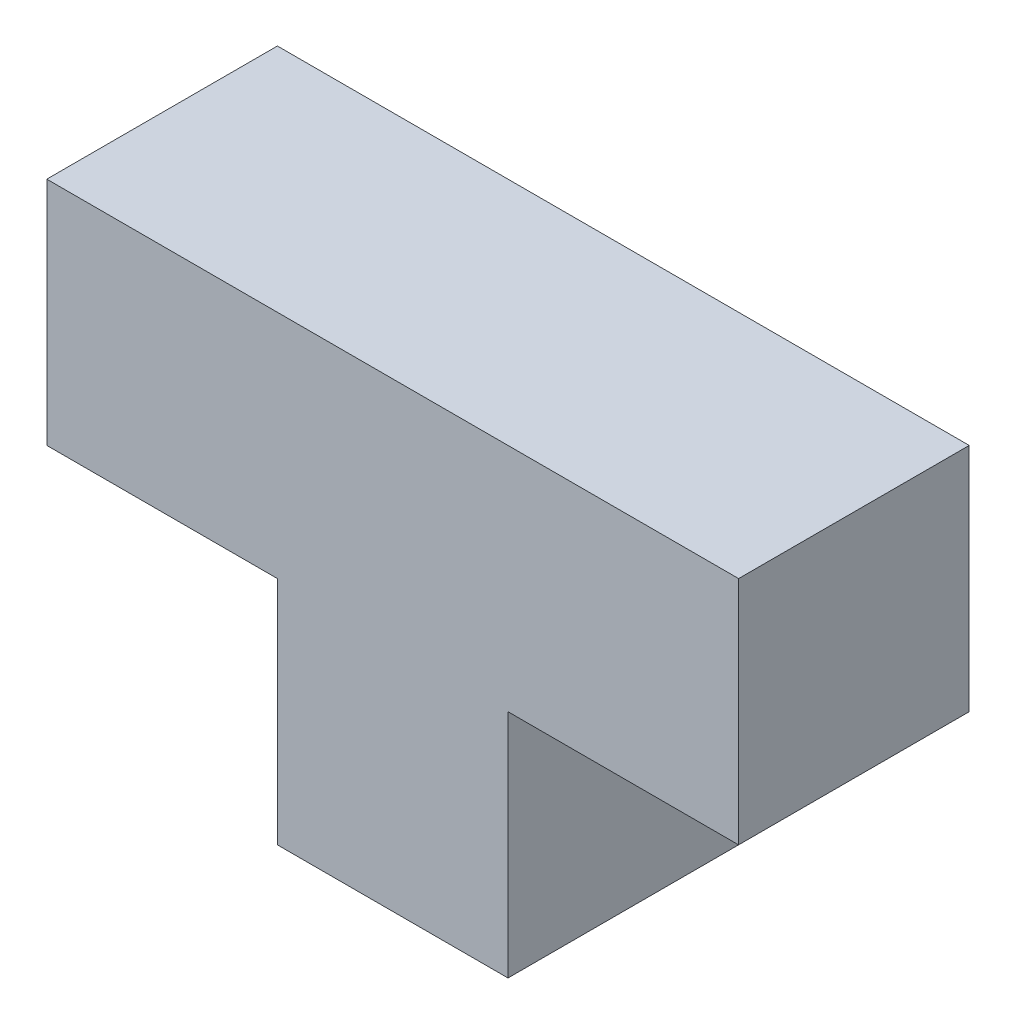
ISO-10303-21;
HEADER;
FILE_DESCRIPTION(('STEP AP214'),'2;1');
FILE_NAME('part.step','',(''),(''),'','','');
FILE_SCHEMA(('AUTOMOTIVE_DESIGN { 1 0 10303 214 1 1 1 1 }'));
ENDSEC;
DATA;
#1=APPLICATION_CONTEXT('core data for automotive mechanical design processes');
#2=APPLICATION_PROTOCOL_DEFINITION('international standard','automotive_design',2000,#1);
#3=PRODUCT_CONTEXT('',#1,'mechanical');
#4=PRODUCT('Part','Part','',(#3));
#5=PRODUCT_RELATED_PRODUCT_CATEGORY('part','',(#4));
#6=PRODUCT_DEFINITION_FORMATION('','',#4);
#7=PRODUCT_DEFINITION_CONTEXT('part definition',#1,'design');
#8=PRODUCT_DEFINITION('design','',#6,#7);
#9=PRODUCT_DEFINITION_SHAPE('','',#8);
#10=(LENGTH_UNIT() NAMED_UNIT(*) SI_UNIT(.MILLI.,.METRE.));
#11=(NAMED_UNIT(*) PLANE_ANGLE_UNIT() SI_UNIT($,.RADIAN.));
#12=(NAMED_UNIT(*) SI_UNIT($,.STERADIAN.) SOLID_ANGLE_UNIT());
#13=UNCERTAINTY_MEASURE_WITH_UNIT(LENGTH_MEASURE(1.E-05),#10,'distance_accuracy_value','');
#14=(GEOMETRIC_REPRESENTATION_CONTEXT(3) GLOBAL_UNCERTAINTY_ASSIGNED_CONTEXT((#13)) GLOBAL_UNIT_ASSIGNED_CONTEXT((#10,
#11,#12)) REPRESENTATION_CONTEXT('',''));
#15=CARTESIAN_POINT('',(0.,0.,0.));
#16=DIRECTION('',(0.,0.,1.));
#17=DIRECTION('',(1.,0.,0.));
#18=AXIS2_PLACEMENT_3D('',#15,#16,#17);
#19=CARTESIAN_POINT('',(19.05,19.05,19.05));
#20=DIRECTION('',(1.,0.,0.));
#21=DIRECTION('',(0.,1.,0.));
#22=AXIS2_PLACEMENT_3D('',#19,#20,#21);
#23=PLANE('',#22);
#24=DIRECTION('',(0.,-1.,0.));
#25=VECTOR('',#24,1.);
#26=CARTESIAN_POINT('',(19.05,19.05,0.));
#27=LINE('',#26,#25);
#28=CARTESIAN_POINT('',(19.05,19.05,0.));
#29=VERTEX_POINT('',#28);
#30=CARTESIAN_POINT('',(19.05,0.,0.));
#31=VERTEX_POINT('',#30);
#32=EDGE_CURVE('E138',#29,#31,#27,.T.);
#33=ORIENTED_EDGE('',*,*,#32,.F.);
#34=DIRECTION('',(0.,0.,-1.));
#35=VECTOR('',#34,1.);
#36=CARTESIAN_POINT('',(19.05,19.05,19.05));
#37=LINE('',#36,#35);
#38=CARTESIAN_POINT('',(19.05,19.05,19.05));
#39=VERTEX_POINT('',#38);
#40=EDGE_CURVE('E11',#39,#29,#37,.T.);
#41=ORIENTED_EDGE('',*,*,#40,.F.);
#42=DIRECTION('',(0.,-1.,0.));
#43=VECTOR('',#42,1.);
#44=CARTESIAN_POINT('',(19.05,19.05,19.05));
#45=LINE('',#44,#43);
#46=CARTESIAN_POINT('',(19.05,0.,19.05));
#47=VERTEX_POINT('',#46);
#48=EDGE_CURVE('E156',#39,#47,#45,.T.);
#49=ORIENTED_EDGE('',*,*,#48,.T.);
#50=DIRECTION('',(0.,0.,-1.));
#51=VECTOR('',#50,1.);
#52=CARTESIAN_POINT('',(19.05,0.,19.05));
#53=LINE('',#52,#51);
#54=EDGE_CURVE('E42',#47,#31,#53,.T.);
#55=ORIENTED_EDGE('',*,*,#54,.T.);
#56=EDGE_LOOP('',(#33,#41,#49,#55));
#57=FACE_BOUND('',#56,.T.);
#58=ADVANCED_FACE('F41',(#57),#23,.T.);
#59=CARTESIAN_POINT('',(38.1,19.05,19.05));
#60=DIRECTION('',(0.,-1.,0.));
#61=DIRECTION('',(1.,0.,0.));
#62=AXIS2_PLACEMENT_3D('',#59,#60,#61);
#63=PLANE('',#62);
#64=DIRECTION('',(-1.,0.,0.));
#65=VECTOR('',#64,1.);
#66=CARTESIAN_POINT('',(38.1,19.05,0.));
#67=LINE('',#66,#65);
#68=CARTESIAN_POINT('',(38.1,19.05,0.));
#69=VERTEX_POINT('',#68);
#70=EDGE_CURVE('E157',#69,#29,#67,.T.);
#71=ORIENTED_EDGE('',*,*,#70,.F.);
#72=DIRECTION('',(0.,0.,-1.));
#73=VECTOR('',#72,1.);
#74=CARTESIAN_POINT('',(38.1,19.05,19.05));
#75=LINE('',#74,#73);
#76=CARTESIAN_POINT('',(38.1,19.05,19.05));
#77=VERTEX_POINT('',#76);
#78=EDGE_CURVE('E49',#77,#69,#75,.T.);
#79=ORIENTED_EDGE('',*,*,#78,.F.);
#80=DIRECTION('',(-1.,0.,0.));
#81=VECTOR('',#80,1.);
#82=CARTESIAN_POINT('',(38.1,19.05,19.05));
#83=LINE('',#82,#81);
#84=EDGE_CURVE('E126',#77,#39,#83,.T.);
#85=ORIENTED_EDGE('',*,*,#84,.T.);
#86=ORIENTED_EDGE('',*,*,#40,.T.);
#87=EDGE_LOOP('',(#71,#79,#85,#86));
#88=FACE_BOUND('',#87,.T.);
#89=ADVANCED_FACE('F169',(#88),#63,.T.);
#90=CARTESIAN_POINT('',(38.1,38.1,19.05));
#91=DIRECTION('',(1.,0.,0.));
#92=DIRECTION('',(0.,1.,0.));
#93=AXIS2_PLACEMENT_3D('',#90,#91,#92);
#94=PLANE('',#93);
#95=DIRECTION('',(0.,-1.,0.));
#96=VECTOR('',#95,1.);
#97=CARTESIAN_POINT('',(38.1,38.1,0.));
#98=LINE('',#97,#96);
#99=CARTESIAN_POINT('',(38.1,38.1,0.));
#100=VERTEX_POINT('',#99);
#101=EDGE_CURVE('E113',#100,#69,#98,.T.);
#102=ORIENTED_EDGE('',*,*,#101,.F.);
#103=DIRECTION('',(0.,0.,-1.));
#104=VECTOR('',#103,1.);
#105=CARTESIAN_POINT('',(38.1,38.1,19.05));
#106=LINE('',#105,#104);
#107=CARTESIAN_POINT('',(38.1,38.1,19.05));
#108=VERTEX_POINT('',#107);
#109=EDGE_CURVE('E110',#108,#100,#106,.T.);
#110=ORIENTED_EDGE('',*,*,#109,.F.);
#111=DIRECTION('',(0.,-1.,0.));
#112=VECTOR('',#111,1.);
#113=CARTESIAN_POINT('',(38.1,38.1,19.05));
#114=LINE('',#113,#112);
#115=EDGE_CURVE('E111',#108,#77,#114,.T.);
#116=ORIENTED_EDGE('',*,*,#115,.T.);
#117=ORIENTED_EDGE('',*,*,#78,.T.);
#118=EDGE_LOOP('',(#102,#110,#116,#117));
#119=FACE_BOUND('',#118,.T.);
#120=ADVANCED_FACE('F115',(#119),#94,.T.);
#121=CARTESIAN_POINT('',(-19.05,38.1,19.05));
#122=DIRECTION('',(0.,1.,0.));
#123=DIRECTION('',(-1.,0.,0.));
#124=AXIS2_PLACEMENT_3D('',#121,#122,#123);
#125=PLANE('',#124);
#126=DIRECTION('',(1.,0.,0.));
#127=VECTOR('',#126,1.);
#128=CARTESIAN_POINT('',(-19.05,38.1,0.));
#129=LINE('',#128,#127);
#130=CARTESIAN_POINT('',(-19.05,38.1,0.));
#131=VERTEX_POINT('',#130);
#132=EDGE_CURVE('E154',#131,#100,#129,.T.);
#133=ORIENTED_EDGE('',*,*,#132,.F.);
#134=DIRECTION('',(0.,0.,-1.));
#135=VECTOR('',#134,1.);
#136=CARTESIAN_POINT('',(-19.05,38.1,19.05));
#137=LINE('',#136,#135);
#138=CARTESIAN_POINT('',(-19.05,38.1,19.05));
#139=VERTEX_POINT('',#138);
#140=EDGE_CURVE('E120',#139,#131,#137,.T.);
#141=ORIENTED_EDGE('',*,*,#140,.F.);
#142=DIRECTION('',(1.,0.,0.));
#143=VECTOR('',#142,1.);
#144=CARTESIAN_POINT('',(-19.05,38.1,19.05));
#145=LINE('',#144,#143);
#146=EDGE_CURVE('E128',#139,#108,#145,.T.);
#147=ORIENTED_EDGE('',*,*,#146,.T.);
#148=ORIENTED_EDGE('',*,*,#109,.T.);
#149=EDGE_LOOP('',(#133,#141,#147,#148));
#150=FACE_BOUND('',#149,.T.);
#151=ADVANCED_FACE('F127',(#150),#125,.T.);
#152=CARTESIAN_POINT('',(-19.05,19.05,19.05));
#153=DIRECTION('',(-1.,0.,0.));
#154=DIRECTION('',(0.,-1.,0.));
#155=AXIS2_PLACEMENT_3D('',#152,#153,#154);
#156=PLANE('',#155);
#157=DIRECTION('',(0.,1.,0.));
#158=VECTOR('',#157,1.);
#159=CARTESIAN_POINT('',(-19.05,19.05,0.));
#160=LINE('',#159,#158);
#161=CARTESIAN_POINT('',(-19.05,19.05,0.));
#162=VERTEX_POINT('',#161);
#163=EDGE_CURVE('E148',#162,#131,#160,.T.);
#164=ORIENTED_EDGE('',*,*,#163,.F.);
#165=DIRECTION('',(0.,0.,-1.));
#166=VECTOR('',#165,1.);
#167=CARTESIAN_POINT('',(-19.05,19.05,19.05));
#168=LINE('',#167,#166);
#169=CARTESIAN_POINT('',(-19.05,19.05,19.05));
#170=VERTEX_POINT('',#169);
#171=EDGE_CURVE('E162',#170,#162,#168,.T.);
#172=ORIENTED_EDGE('',*,*,#171,.F.);
#173=DIRECTION('',(0.,1.,0.));
#174=VECTOR('',#173,1.);
#175=CARTESIAN_POINT('',(-19.05,19.05,19.05));
#176=LINE('',#175,#174);
#177=EDGE_CURVE('E131',#170,#139,#176,.T.);
#178=ORIENTED_EDGE('',*,*,#177,.T.);
#179=ORIENTED_EDGE('',*,*,#140,.T.);
#180=EDGE_LOOP('',(#164,#172,#178,#179));
#181=FACE_BOUND('',#180,.T.);
#182=ADVANCED_FACE('F183',(#181),#156,.T.);
#183=CARTESIAN_POINT('',(0.,19.05,19.05));
#184=DIRECTION('',(0.,-1.,0.));
#185=DIRECTION('',(0.,0.,-1.));
#186=AXIS2_PLACEMENT_3D('',#183,#184,#185);
#187=PLANE('',#186);
#188=DIRECTION('',(-1.,0.,0.));
#189=VECTOR('',#188,1.);
#190=CARTESIAN_POINT('',(0.,19.05,0.));
#191=LINE('',#190,#189);
#192=CARTESIAN_POINT('',(0.,19.05,0.));
#193=VERTEX_POINT('',#192);
#194=EDGE_CURVE('E150',#193,#162,#191,.T.);
#195=ORIENTED_EDGE('',*,*,#194,.F.);
#196=DIRECTION('',(0.,0.,-1.));
#197=VECTOR('',#196,1.);
#198=CARTESIAN_POINT('',(0.,19.05,19.05));
#199=LINE('',#198,#197);
#200=CARTESIAN_POINT('',(0.,19.05,19.05));
#201=VERTEX_POINT('',#200);
#202=EDGE_CURVE('E163',#201,#193,#199,.T.);
#203=ORIENTED_EDGE('',*,*,#202,.F.);
#204=DIRECTION('',(-1.,0.,0.));
#205=VECTOR('',#204,1.);
#206=CARTESIAN_POINT('',(0.,19.05,19.05));
#207=LINE('',#206,#205);
#208=EDGE_CURVE('E133',#201,#170,#207,.T.);
#209=ORIENTED_EDGE('',*,*,#208,.T.);
#210=ORIENTED_EDGE('',*,*,#171,.T.);
#211=EDGE_LOOP('',(#195,#203,#209,#210));
#212=FACE_BOUND('',#211,.T.);
#213=ADVANCED_FACE('F186',(#212),#187,.T.);
#214=CARTESIAN_POINT('',(0.,0.,19.05));
#215=DIRECTION('',(-1.,0.,0.));
#216=DIRECTION('',(0.,-1.,0.));
#217=AXIS2_PLACEMENT_3D('',#214,#215,#216);
#218=PLANE('',#217);
#219=DIRECTION('',(0.,1.,0.));
#220=VECTOR('',#219,1.);
#221=CARTESIAN_POINT('',(0.,0.,0.));
#222=LINE('',#221,#220);
#223=CARTESIAN_POINT('',(0.,0.,0.));
#224=VERTEX_POINT('',#223);
#225=EDGE_CURVE('E143',#224,#193,#222,.T.);
#226=ORIENTED_EDGE('',*,*,#225,.F.);
#227=DIRECTION('',(0.,0.,-1.));
#228=VECTOR('',#227,1.);
#229=CARTESIAN_POINT('',(0.,0.,19.05));
#230=LINE('',#229,#228);
#231=CARTESIAN_POINT('',(0.,0.,19.05));
#232=VERTEX_POINT('',#231);
#233=EDGE_CURVE('E165',#232,#224,#230,.T.);
#234=ORIENTED_EDGE('',*,*,#233,.F.);
#235=DIRECTION('',(0.,1.,0.));
#236=VECTOR('',#235,1.);
#237=CARTESIAN_POINT('',(0.,0.,19.05));
#238=LINE('',#237,#236);
#239=EDGE_CURVE('E263',#232,#201,#238,.T.);
#240=ORIENTED_EDGE('',*,*,#239,.T.);
#241=ORIENTED_EDGE('',*,*,#202,.T.);
#242=EDGE_LOOP('',(#226,#234,#240,#241));
#243=FACE_BOUND('',#242,.T.);
#244=ADVANCED_FACE('F189',(#243),#218,.T.);
#245=CARTESIAN_POINT('',(19.05,0.,19.05));
#246=DIRECTION('',(0.,-1.,0.));
#247=DIRECTION('',(1.,0.,0.));
#248=AXIS2_PLACEMENT_3D('',#245,#246,#247);
#249=PLANE('',#248);
#250=DIRECTION('',(-1.,0.,0.));
#251=VECTOR('',#250,1.);
#252=CARTESIAN_POINT('',(19.05,0.,0.));
#253=LINE('',#252,#251);
#254=EDGE_CURVE('E141',#31,#224,#253,.T.);
#255=ORIENTED_EDGE('',*,*,#254,.F.);
#256=ORIENTED_EDGE('',*,*,#54,.F.);
#257=DIRECTION('',(-1.,0.,0.));
#258=VECTOR('',#257,1.);
#259=CARTESIAN_POINT('',(19.05,0.,19.05));
#260=LINE('',#259,#258);
#261=EDGE_CURVE('E265',#47,#232,#260,.T.);
#262=ORIENTED_EDGE('',*,*,#261,.T.);
#263=ORIENTED_EDGE('',*,*,#233,.T.);
#264=EDGE_LOOP('',(#255,#256,#262,#263));
#265=FACE_BOUND('',#264,.T.);
#266=ADVANCED_FACE('F167',(#265),#249,.T.);
#267=CARTESIAN_POINT('',(0.,0.,19.05));
#268=DIRECTION('',(0.,0.,-1.));
#269=DIRECTION('',(-1.,0.,0.));
#270=AXIS2_PLACEMENT_3D('',#267,#268,#269);
#271=PLANE('',#270);
#272=ORIENTED_EDGE('',*,*,#48,.F.);
#273=ORIENTED_EDGE('',*,*,#84,.F.);
#274=ORIENTED_EDGE('',*,*,#115,.F.);
#275=ORIENTED_EDGE('',*,*,#146,.F.);
#276=ORIENTED_EDGE('',*,*,#177,.F.);
#277=ORIENTED_EDGE('',*,*,#208,.F.);
#278=ORIENTED_EDGE('',*,*,#239,.F.);
#279=ORIENTED_EDGE('',*,*,#261,.F.);
#280=EDGE_LOOP('',(#272,#273,#274,#275,#276,#277,#278,#279));
#281=FACE_BOUND('',#280,.T.);
#282=ADVANCED_FACE('F125',(#281),#271,.F.);
#283=CARTESIAN_POINT('',(0.,0.,0.));
#284=DIRECTION('',(0.,0.,-1.));
#285=DIRECTION('',(-1.,0.,0.));
#286=AXIS2_PLACEMENT_3D('',#283,#284,#285);
#287=PLANE('',#286);
#288=ORIENTED_EDGE('',*,*,#32,.T.);
#289=ORIENTED_EDGE('',*,*,#254,.T.);
#290=ORIENTED_EDGE('',*,*,#225,.T.);
#291=ORIENTED_EDGE('',*,*,#194,.T.);
#292=ORIENTED_EDGE('',*,*,#163,.T.);
#293=ORIENTED_EDGE('',*,*,#132,.T.);
#294=ORIENTED_EDGE('',*,*,#101,.T.);
#295=ORIENTED_EDGE('',*,*,#70,.T.);
#296=EDGE_LOOP('',(#288,#289,#290,#291,#292,#293,#294,#295));
#297=FACE_BOUND('',#296,.T.);
#298=ADVANCED_FACE('F170',(#297),#287,.T.);
#299=CLOSED_SHELL('',(#58,#89,#120,#151,#182,#213,#244,#266,#282,#298));
#300=MANIFOLD_SOLID_BREP('B2',#299);
#301=ADVANCED_BREP_SHAPE_REPRESENTATION('',(#18,#300),#14);
#302=SHAPE_DEFINITION_REPRESENTATION(#9,#301);
ENDSEC;
END-ISO-10303-21;
